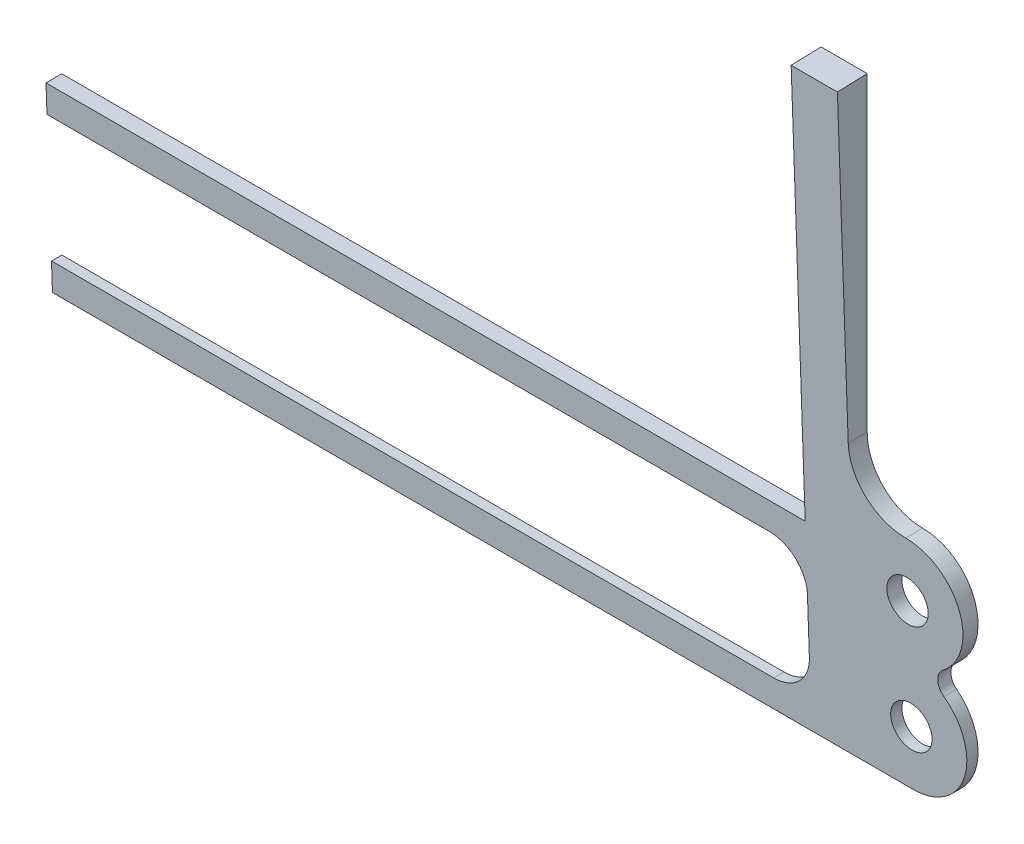
ISO-10303-21;
HEADER;
FILE_DESCRIPTION(('STEP AP214'),'2;1');
FILE_NAME('part.step','',(''),(''),'','','');
FILE_SCHEMA(('AUTOMOTIVE_DESIGN { 1 0 10303 214 1 1 1 1 }'));
ENDSEC;
DATA;
#1=APPLICATION_CONTEXT('core data for automotive mechanical design processes');
#2=APPLICATION_PROTOCOL_DEFINITION('international standard','automotive_design',2000,#1);
#3=PRODUCT_CONTEXT('',#1,'mechanical');
#4=PRODUCT('Part','Part','',(#3));
#5=PRODUCT_RELATED_PRODUCT_CATEGORY('part','',(#4));
#6=PRODUCT_DEFINITION_FORMATION('','',#4);
#7=PRODUCT_DEFINITION_CONTEXT('part definition',#1,'design');
#8=PRODUCT_DEFINITION('design','',#6,#7);
#9=PRODUCT_DEFINITION_SHAPE('','',#8);
#10=(LENGTH_UNIT() NAMED_UNIT(*) SI_UNIT(.MILLI.,.METRE.));
#11=(NAMED_UNIT(*) PLANE_ANGLE_UNIT() SI_UNIT($,.RADIAN.));
#12=(NAMED_UNIT(*) SI_UNIT($,.STERADIAN.) SOLID_ANGLE_UNIT());
#13=UNCERTAINTY_MEASURE_WITH_UNIT(LENGTH_MEASURE(1.E-05),#10,'distance_accuracy_value','');
#14=(GEOMETRIC_REPRESENTATION_CONTEXT(3) GLOBAL_UNCERTAINTY_ASSIGNED_CONTEXT((#13)) GLOBAL_UNIT_ASSIGNED_CONTEXT((#10,
#11,#12)) REPRESENTATION_CONTEXT('',''));
#15=CARTESIAN_POINT('',(0.,0.,0.));
#16=DIRECTION('',(0.,0.,1.));
#17=DIRECTION('',(1.,0.,0.));
#18=AXIS2_PLACEMENT_3D('',#15,#16,#17);
#19=CARTESIAN_POINT('',(-7.95019999999749,0.,76.2));
#20=DIRECTION('',(1.,0.,0.));
#21=DIRECTION('',(0.,0.,-1.));
#22=AXIS2_PLACEMENT_3D('',#19,#20,#21);
#23=PLANE('',#22);
#24=DIRECTION('',(0.,0.999390827019096,0.0348994967025044));
#25=VECTOR('',#24,1.);
#26=CARTESIAN_POINT('',(-7.95019999999749,2.57484000352105,2.46622949619527));
#27=LINE('',#26,#25);
#28=CARTESIAN_POINT('',(-7.95019999999749,9.52500000000004,2.70893443136311));
#29=VERTEX_POINT('',#28);
#30=CARTESIAN_POINT('',(-7.95019999999749,78.5876000000001,5.12065356646412));
#31=VERTEX_POINT('',#30);
#32=EDGE_CURVE('E283',#29,#31,#27,.T.);
#33=ORIENTED_EDGE('',*,*,#32,.T.);
#34=DIRECTION('',(0.,0.0348994967025044,-0.999390827019096));
#35=VECTOR('',#34,1.);
#36=CARTESIAN_POINT('',(-7.95019999999749,76.012759996479,78.8544240702688));
#37=LINE('',#36,#35);
#38=CARTESIAN_POINT('',(-7.95019999999749,78.7664171628417,0.));
#39=VERTEX_POINT('',#38);
#40=EDGE_CURVE('E50',#31,#39,#37,.T.);
#41=ORIENTED_EDGE('',*,*,#40,.T.);
#42=DIRECTION('',(0.,-1.,0.));
#43=VECTOR('',#42,1.);
#44=CARTESIAN_POINT('',(-7.95019999999749,0.,0.));
#45=LINE('',#44,#43);
#46=CARTESIAN_POINT('',(-7.95019999999749,9.52500000000006,0.));
#47=VERTEX_POINT('',#46);
#48=EDGE_CURVE('E192',#39,#47,#45,.T.);
#49=ORIENTED_EDGE('',*,*,#48,.T.);
#50=DIRECTION('',(0.,0.,-1.));
#51=VECTOR('',#50,1.);
#52=CARTESIAN_POINT('',(-7.95019999999749,9.52500000000006,76.2));
#53=LINE('',#52,#51);
#54=EDGE_CURVE('E204',#29,#47,#53,.T.);
#55=ORIENTED_EDGE('',*,*,#54,.F.);
#56=EDGE_LOOP('',(#33,#41,#49,#55));
#57=FACE_BOUND('',#56,.T.);
#58=ADVANCED_FACE('F35',(#57),#23,.F.);
#59=CARTESIAN_POINT('',(0.,9.52500000000004,76.2));
#60=DIRECTION('',(0.,-1.,0.));
#61=DIRECTION('',(1.,0.,0.));
#62=AXIS2_PLACEMENT_3D('',#59,#60,#61);
#63=PLANE('',#62);
#64=DIRECTION('',(-1.,0.,0.));
#65=VECTOR('',#64,1.);
#66=CARTESIAN_POINT('',(0.,9.52500000000004,0.));
#67=LINE('',#66,#65);
#68=CARTESIAN_POINT('',(-138.423649999999,9.52500000000005,0.));
#69=VERTEX_POINT('',#68);
#70=EDGE_CURVE('E194',#47,#69,#67,.T.);
#71=ORIENTED_EDGE('',*,*,#70,.T.);
#72=DIRECTION('',(0.,0.,1.));
#73=VECTOR('',#72,1.);
#74=CARTESIAN_POINT('',(-138.423649999999,9.52500000000004,76.2));
#75=LINE('',#74,#73);
#76=CARTESIAN_POINT('',(-138.423649999999,9.52500000000006,2.7089344313631));
#77=VERTEX_POINT('',#76);
#78=EDGE_CURVE('E358',#69,#77,#75,.T.);
#79=ORIENTED_EDGE('',*,*,#78,.T.);
#80=DIRECTION('',(1.,0.,0.));
#81=VECTOR('',#80,1.);
#82=CARTESIAN_POINT('',(0.,9.52500000000004,2.70893443136311));
#83=LINE('',#82,#81);
#84=EDGE_CURVE('E281',#77,#29,#83,.T.);
#85=ORIENTED_EDGE('',*,*,#84,.T.);
#86=ORIENTED_EDGE('',*,*,#54,.T.);
#87=EDGE_LOOP('',(#71,#79,#85,#86));
#88=FACE_BOUND('',#87,.T.);
#89=ADVANCED_FACE('F309',(#88),#63,.F.);
#90=CARTESIAN_POINT('',(0.,-22.225,76.2));
#91=DIRECTION('',(0.,1.,0.));
#92=DIRECTION('',(0.,0.,1.));
#93=AXIS2_PLACEMENT_3D('',#90,#91,#92);
#94=PLANE('',#93);
#95=DIRECTION('',(-1.,0.,0.));
#96=VECTOR('',#95,1.);
#97=CARTESIAN_POINT('',(19.0500000000025,-22.225,1.6002));
#98=LINE('',#97,#96);
#99=CARTESIAN_POINT('',(9.52500000000168,-22.2249999999999,1.6002));
#100=VERTEX_POINT('',#99);
#101=CARTESIAN_POINT('',(-138.423649999999,-22.225,1.6002));
#102=VERTEX_POINT('',#101);
#103=EDGE_CURVE('E273',#100,#102,#98,.T.);
#104=ORIENTED_EDGE('',*,*,#103,.T.);
#105=DIRECTION('',(0.,0.,-1.));
#106=VECTOR('',#105,1.);
#107=CARTESIAN_POINT('',(-138.423649999999,-22.225,76.2));
#108=LINE('',#107,#106);
#109=CARTESIAN_POINT('',(-138.423649999999,-22.225,0.));
#110=VERTEX_POINT('',#109);
#111=EDGE_CURVE('E275',#102,#110,#108,.T.);
#112=ORIENTED_EDGE('',*,*,#111,.T.);
#113=DIRECTION('',(1.,0.,0.));
#114=VECTOR('',#113,1.);
#115=CARTESIAN_POINT('',(0.,-22.225,0.));
#116=LINE('',#115,#114);
#117=CARTESIAN_POINT('',(9.52500000000168,-22.2249999999999,0.));
#118=VERTEX_POINT('',#117);
#119=EDGE_CURVE('E181',#110,#118,#116,.T.);
#120=ORIENTED_EDGE('',*,*,#119,.T.);
#121=DIRECTION('',(0.,0.,-1.));
#122=VECTOR('',#121,1.);
#123=CARTESIAN_POINT('',(9.52500000000168,-22.2249999999999,76.2));
#124=LINE('',#123,#122);
#125=EDGE_CURVE('E208',#100,#118,#124,.T.);
#126=ORIENTED_EDGE('',*,*,#125,.F.);
#127=EDGE_LOOP('',(#104,#112,#120,#126));
#128=FACE_BOUND('',#127,.T.);
#129=ADVANCED_FACE('F315',(#128),#94,.F.);
#130=CARTESIAN_POINT('',(9.52500000000168,-12.6999999999999,76.2));
#131=DIRECTION('',(0.,0.,-1.));
#132=DIRECTION('',(-1.,0.,0.));
#133=AXIS2_PLACEMENT_3D('',#130,#131,#132);
#134=CYLINDRICAL_SURFACE('',#133,9.525);
#135=CARTESIAN_POINT('',(9.52500000000168,-12.6999999999999,0.));
#136=DIRECTION('',(0.,0.,1.));
#137=DIRECTION('',(1.,0.,0.));
#138=AXIS2_PLACEMENT_3D('',#135,#136,#137);
#139=CIRCLE('',#138,9.525);
#140=CARTESIAN_POINT('',(15.3712965050969,-5.18026315789494,0.));
#141=VERTEX_POINT('',#140);
#142=EDGE_CURVE('E183',#118,#141,#139,.T.);
#143=ORIENTED_EDGE('',*,*,#142,.T.);
#144=DIRECTION('',(0.,0.,-1.));
#145=VECTOR('',#144,1.);
#146=CARTESIAN_POINT('',(15.3712965050969,-5.18026315789494,76.2));
#147=LINE('',#146,#145);
#148=CARTESIAN_POINT('',(15.3712965050969,-5.18026315789493,2.19541532631071));
#149=VERTEX_POINT('',#148);
#150=EDGE_CURVE('E217',#141,#149,#147,.F.);
#151=ORIENTED_EDGE('',*,*,#150,.T.);
#152=CARTESIAN_POINT('',(9.52500000000168,-12.6999999999999,1.93282032940893));
#153=DIRECTION('',(0.,0.0348994967025044,-0.999390827019096));
#154=DIRECTION('',(0.,-0.999390827019096,-0.0348994967025044));
#155=AXIS2_PLACEMENT_3D('',#152,#153,#154);
#156=ELLIPSE('',#155,9.53080590944628,9.525);
#157=EDGE_CURVE('E179',#149,#100,#156,.T.);
#158=ORIENTED_EDGE('',*,*,#157,.T.);
#159=ORIENTED_EDGE('',*,*,#125,.T.);
#160=EDGE_LOOP('',(#143,#151,#158,#159));
#161=FACE_BOUND('',#160,.T.);
#162=ADVANCED_FACE('F325',(#161),#134,.T.);
#163=CARTESIAN_POINT('',(9.52500000000251,6.35000000000005,76.2));
#164=DIRECTION('',(0.,0.,-1.));
#165=DIRECTION('',(-1.,0.,0.));
#166=AXIS2_PLACEMENT_3D('',#163,#164,#165);
#167=CYLINDRICAL_SURFACE('',#166,9.525);
#168=CARTESIAN_POINT('',(9.52500000000251,6.35000000000005,2.59806098822679));
#169=DIRECTION('',(0.,0.0348994967025044,-0.999390827019096));
#170=DIRECTION('',(0.,-0.999390827019096,-0.0348994967025044));
#171=AXIS2_PLACEMENT_3D('',#168,#169,#170);
#172=ELLIPSE('',#171,9.53080590944628,9.525);
#173=CARTESIAN_POINT('',(9.52500000000251,15.8750000000001,2.93068131763571));
#174=VERTEX_POINT('',#173);
#175=CARTESIAN_POINT('',(15.3712965050971,-1.16973684210546,2.335465991325));
#176=VERTEX_POINT('',#175);
#177=EDGE_CURVE('E170',#174,#176,#172,.T.);
#178=ORIENTED_EDGE('',*,*,#177,.T.);
#179=DIRECTION('',(0.,0.,-1.));
#180=VECTOR('',#179,1.);
#181=CARTESIAN_POINT('',(15.3712965050971,-1.16973684210546,76.2));
#182=LINE('',#181,#180);
#183=CARTESIAN_POINT('',(15.3712965050971,-1.16973684210546,0.));
#184=VERTEX_POINT('',#183);
#185=EDGE_CURVE('E207',#176,#184,#182,.T.);
#186=ORIENTED_EDGE('',*,*,#185,.T.);
#187=CARTESIAN_POINT('',(9.52500000000251,6.35000000000005,0.));
#188=DIRECTION('',(0.,0.,1.));
#189=DIRECTION('',(1.,0.,0.));
#190=AXIS2_PLACEMENT_3D('',#187,#188,#189);
#191=CIRCLE('',#190,9.525);
#192=CARTESIAN_POINT('',(9.52500000000251,15.8750000000001,0.));
#193=VERTEX_POINT('',#192);
#194=EDGE_CURVE('E186',#184,#193,#191,.T.);
#195=ORIENTED_EDGE('',*,*,#194,.T.);
#196=DIRECTION('',(0.,0.,-1.));
#197=VECTOR('',#196,1.);
#198=CARTESIAN_POINT('',(9.52500000000251,15.8750000000001,76.2));
#199=LINE('',#198,#197);
#200=EDGE_CURVE('E210',#174,#193,#199,.T.);
#201=ORIENTED_EDGE('',*,*,#200,.F.);
#202=EDGE_LOOP('',(#178,#186,#195,#201));
#203=FACE_BOUND('',#202,.T.);
#204=ADVANCED_FACE('F321',(#203),#167,.T.);
#205=CARTESIAN_POINT('',(9.52500000000251,25.4000000000001,76.2));
#206=DIRECTION('',(0.,0.,-1.));
#207=DIRECTION('',(-1.,0.,0.));
#208=AXIS2_PLACEMENT_3D('',#205,#206,#207);
#209=CYLINDRICAL_SURFACE('',#208,9.525);
#210=CARTESIAN_POINT('',(9.52500000000251,25.4000000000001,3.26330164704465));
#211=DIRECTION('',(0.,0.0348994967025044,-0.999390827019096));
#212=DIRECTION('',(0.,-0.999390827019096,-0.0348994967025044));
#213=AXIS2_PLACEMENT_3D('',#210,#211,#212);
#214=ELLIPSE('',#213,9.53080590944628,9.525);
#215=CARTESIAN_POINT('',(0.,25.4000000000001,3.26330164704465));
#216=VERTEX_POINT('',#215);
#217=EDGE_CURVE('E166',#174,#216,#214,.T.);
#218=ORIENTED_EDGE('',*,*,#217,.F.);
#219=ORIENTED_EDGE('',*,*,#200,.T.);
#220=CARTESIAN_POINT('',(9.52500000000251,25.4000000000001,0.));
#221=DIRECTION('',(0.,0.,1.));
#222=DIRECTION('',(1.,0.,0.));
#223=AXIS2_PLACEMENT_3D('',#220,#221,#222);
#224=CIRCLE('',#223,9.525);
#225=CARTESIAN_POINT('',(0.,25.4000000000001,0.));
#226=VERTEX_POINT('',#225);
#227=EDGE_CURVE('E188',#226,#193,#224,.T.);
#228=ORIENTED_EDGE('',*,*,#227,.F.);
#229=DIRECTION('',(0.,0.,-1.));
#230=VECTOR('',#229,1.);
#231=CARTESIAN_POINT('',(0.,25.4000000000001,76.2));
#232=LINE('',#231,#230);
#233=EDGE_CURVE('E203',#216,#226,#232,.T.);
#234=ORIENTED_EDGE('',*,*,#233,.F.);
#235=EDGE_LOOP('',(#218,#219,#228,#234));
#236=FACE_BOUND('',#235,.T.);
#237=ADVANCED_FACE('F305',(#236),#209,.F.);
#238=CARTESIAN_POINT('',(0.,0.,76.2));
#239=DIRECTION('',(-1.,0.,0.));
#240=DIRECTION('',(0.,0.,1.));
#241=AXIS2_PLACEMENT_3D('',#238,#239,#240);
#242=PLANE('',#241);
#243=DIRECTION('',(0.,1.,0.));
#244=VECTOR('',#243,1.);
#245=CARTESIAN_POINT('',(0.,0.,0.));
#246=LINE('',#245,#244);
#247=CARTESIAN_POINT('',(0.,78.7664171628417,0.));
#248=VERTEX_POINT('',#247);
#249=EDGE_CURVE('E162',#226,#248,#246,.T.);
#250=ORIENTED_EDGE('',*,*,#249,.T.);
#251=DIRECTION('',(0.,-0.0348994967025044,0.999390827019096));
#252=VECTOR('',#251,1.);
#253=CARTESIAN_POINT('',(0.,76.012759996479,78.8544240702688));
#254=LINE('',#253,#252);
#255=CARTESIAN_POINT('',(0.,78.5876000000001,5.12065356646412));
#256=VERTEX_POINT('',#255);
#257=EDGE_CURVE('E148',#248,#256,#254,.T.);
#258=ORIENTED_EDGE('',*,*,#257,.T.);
#259=DIRECTION('',(0.,-0.999390827019096,-0.0348994967025044));
#260=VECTOR('',#259,1.);
#261=CARTESIAN_POINT('',(0.,2.57484000352105,2.46622949619527));
#262=LINE('',#261,#260);
#263=EDGE_CURVE('E159',#256,#216,#262,.T.);
#264=ORIENTED_EDGE('',*,*,#263,.T.);
#265=ORIENTED_EDGE('',*,*,#233,.T.);
#266=EDGE_LOOP('',(#250,#258,#264,#265));
#267=FACE_BOUND('',#266,.T.);
#268=ADVANCED_FACE('F158',(#267),#242,.F.);
#269=CARTESIAN_POINT('',(9.52500000000168,-12.6999999999999,76.2));
#270=DIRECTION('',(0.,0.,-1.));
#271=DIRECTION('',(-1.,0.,0.));
#272=AXIS2_PLACEMENT_3D('',#269,#270,#271);
#273=CYLINDRICAL_SURFACE('',#272,3.556);
#274=CARTESIAN_POINT('',(9.52500000000168,-12.6999999999999,1.93282032940893));
#275=DIRECTION('',(0.,0.0348994967025044,-0.999390827019096));
#276=DIRECTION('',(0.,-0.999390827019096,-0.0348994967025044));
#277=AXIS2_PLACEMENT_3D('',#274,#275,#276);
#278=ELLIPSE('',#277,3.55816753952661,3.556);
#279=CARTESIAN_POINT('',(9.52500000000168,-16.2559999999999,1.80864207309627));
#280=VERTEX_POINT('',#279);
#281=EDGE_CURVE('E168',#280,#280,#278,.T.);
#282=ORIENTED_EDGE('',*,*,#281,.F.);
#283=EDGE_LOOP('',(#282));
#284=FACE_BOUND('',#283,.T.);
#285=CARTESIAN_POINT('',(9.52500000000168,-12.6999999999999,0.));
#286=DIRECTION('',(0.,0.,1.));
#287=DIRECTION('',(1.,0.,0.));
#288=AXIS2_PLACEMENT_3D('',#285,#286,#287);
#289=CIRCLE('',#288,3.556);
#290=CARTESIAN_POINT('',(13.0810000000017,-12.6999999999999,0.));
#291=VERTEX_POINT('',#290);
#292=EDGE_CURVE('E200',#291,#291,#289,.T.);
#293=ORIENTED_EDGE('',*,*,#292,.F.);
#294=EDGE_LOOP('',(#293));
#295=FACE_BOUND('',#294,.T.);
#296=ADVANCED_FACE('F291',(#284,#295),#273,.F.);
#297=CARTESIAN_POINT('',(9.52500000000251,6.35000000000005,76.2));
#298=DIRECTION('',(0.,0.,-1.));
#299=DIRECTION('',(-1.,0.,0.));
#300=AXIS2_PLACEMENT_3D('',#297,#298,#299);
#301=CYLINDRICAL_SURFACE('',#300,3.556);
#302=CARTESIAN_POINT('',(9.52500000000251,6.35000000000005,2.59806098822679));
#303=DIRECTION('',(0.,0.0348994967025044,-0.999390827019096));
#304=DIRECTION('',(0.,-0.999390827019096,-0.0348994967025044));
#305=AXIS2_PLACEMENT_3D('',#302,#303,#304);
#306=ELLIPSE('',#305,3.55816753952661,3.556);
#307=CARTESIAN_POINT('',(9.52500000000251,2.79400000000005,2.47388273191412));
#308=VERTEX_POINT('',#307);
#309=EDGE_CURVE('E173',#308,#308,#306,.T.);
#310=ORIENTED_EDGE('',*,*,#309,.F.);
#311=EDGE_LOOP('',(#310));
#312=FACE_BOUND('',#311,.T.);
#313=CARTESIAN_POINT('',(9.52500000000251,6.35000000000005,0.));
#314=DIRECTION('',(0.,0.,1.));
#315=DIRECTION('',(1.,0.,0.));
#316=AXIS2_PLACEMENT_3D('',#313,#314,#315);
#317=CIRCLE('',#316,3.556);
#318=CARTESIAN_POINT('',(13.0810000000025,6.35000000000005,0.));
#319=VERTEX_POINT('',#318);
#320=EDGE_CURVE('E197',#319,#319,#317,.T.);
#321=ORIENTED_EDGE('',*,*,#320,.F.);
#322=EDGE_LOOP('',(#321));
#323=FACE_BOUND('',#322,.T.);
#324=ADVANCED_FACE('F288',(#312,#323),#301,.F.);
#325=CARTESIAN_POINT('',(0.,0.,0.));
#326=DIRECTION('',(0.,0.,1.));
#327=DIRECTION('',(1.,0.,0.));
#328=AXIS2_PLACEMENT_3D('',#325,#326,#327);
#329=PLANE('',#328);
#330=ORIENTED_EDGE('',*,*,#48,.F.);
#331=DIRECTION('',(1.,0.,0.));
#332=VECTOR('',#331,1.);
#333=CARTESIAN_POINT('',(0.,78.7664171628417,0.));
#334=LINE('',#333,#332);
#335=EDGE_CURVE('E154',#39,#248,#334,.T.);
#336=ORIENTED_EDGE('',*,*,#335,.T.);
#337=ORIENTED_EDGE('',*,*,#249,.F.);
#338=ORIENTED_EDGE('',*,*,#227,.T.);
#339=ORIENTED_EDGE('',*,*,#194,.F.);
#340=CARTESIAN_POINT('',(16.9303089064556,-3.17500000000027,0.));
#341=DIRECTION('',(0.,0.,1.));
#342=DIRECTION('',(1.,0.,0.));
#343=AXIS2_PLACEMENT_3D('',#340,#341,#342);
#344=CIRCLE('',#343,2.54);
#345=EDGE_CURVE('E219',#184,#141,#344,.T.);
#346=ORIENTED_EDGE('',*,*,#345,.T.);
#347=ORIENTED_EDGE('',*,*,#142,.F.);
#348=ORIENTED_EDGE('',*,*,#119,.F.);
#349=DIRECTION('',(0.,1.,0.));
#350=VECTOR('',#349,1.);
#351=CARTESIAN_POINT('',(-138.423649999999,0.,0.));
#352=LINE('',#351,#350);
#353=CARTESIAN_POINT('',(-138.423649999999,-17.4498,0.));
#354=VERTEX_POINT('',#353);
#355=EDGE_CURVE('E360',#110,#354,#352,.T.);
#356=ORIENTED_EDGE('',*,*,#355,.T.);
#357=DIRECTION('',(-1.,0.,0.));
#358=VECTOR('',#357,1.);
#359=CARTESIAN_POINT('',(-268.897099999997,-17.4498,0.));
#360=LINE('',#359,#358);
#361=CARTESIAN_POINT('',(-14.3001999999975,-17.4497999999999,0.));
#362=VERTEX_POINT('',#361);
#363=EDGE_CURVE('E267',#362,#354,#360,.T.);
#364=ORIENTED_EDGE('',*,*,#363,.F.);
#365=CARTESIAN_POINT('',(-14.3001999999975,-11.0997999999999,0.));
#366=DIRECTION('',(0.,0.,1.));
#367=DIRECTION('',(1.,0.,0.));
#368=AXIS2_PLACEMENT_3D('',#365,#366,#367);
#369=CIRCLE('',#368,6.35);
#370=CARTESIAN_POINT('',(-7.9501999999975,-11.0998,0.));
#371=VERTEX_POINT('',#370);
#372=EDGE_CURVE('E247',#362,#371,#369,.T.);
#373=ORIENTED_EDGE('',*,*,#372,.T.);
#374=DIRECTION('',(0.,-1.,0.));
#375=VECTOR('',#374,1.);
#376=CARTESIAN_POINT('',(-7.95019999999749,4.74980000000006,0.));
#377=LINE('',#376,#375);
#378=CARTESIAN_POINT('',(-7.9501999999975,-1.60019999999994,0.));
#379=VERTEX_POINT('',#378);
#380=EDGE_CURVE('E265',#379,#371,#377,.T.);
#381=ORIENTED_EDGE('',*,*,#380,.F.);
#382=CARTESIAN_POINT('',(-14.3001999999975,-1.60019999999994,0.));
#383=DIRECTION('',(0.,0.,1.));
#384=DIRECTION('',(1.,0.,0.));
#385=AXIS2_PLACEMENT_3D('',#382,#383,#384);
#386=CIRCLE('',#385,6.35);
#387=CARTESIAN_POINT('',(-14.3001999999975,4.74980000000006,0.));
#388=VERTEX_POINT('',#387);
#389=EDGE_CURVE('E242',#379,#388,#386,.T.);
#390=ORIENTED_EDGE('',*,*,#389,.T.);
#391=DIRECTION('',(1.,0.,0.));
#392=VECTOR('',#391,1.);
#393=CARTESIAN_POINT('',(-7.95019999999749,4.74980000000006,0.));
#394=LINE('',#393,#392);
#395=CARTESIAN_POINT('',(-138.423649999999,4.74980000000005,0.));
#396=VERTEX_POINT('',#395);
#397=EDGE_CURVE('E271',#396,#388,#394,.T.);
#398=ORIENTED_EDGE('',*,*,#397,.F.);
#399=EDGE_CURVE('E356',#396,#69,#352,.T.);
#400=ORIENTED_EDGE('',*,*,#399,.T.);
#401=ORIENTED_EDGE('',*,*,#70,.F.);
#402=EDGE_LOOP('',(#330,#336,#337,#338,#339,#346,#347,#348,#356,#364,#373,#381,#390,#398,#400,#401));
#403=FACE_BOUND('',#402,.T.);
#404=ORIENTED_EDGE('',*,*,#320,.T.);
#405=EDGE_LOOP('',(#404));
#406=FACE_BOUND('',#405,.T.);
#407=ORIENTED_EDGE('',*,*,#292,.T.);
#408=EDGE_LOOP('',(#407));
#409=FACE_BOUND('',#408,.T.);
#410=ADVANCED_FACE('F263',(#403,#406,#409),#329,.F.);
#411=CARTESIAN_POINT('',(19.0500000000025,-22.225,1.6002));
#412=DIRECTION('',(0.,0.0348994967025044,-0.999390827019096));
#413=DIRECTION('',(0.,0.999390827019096,0.0348994967025044));
#414=AXIS2_PLACEMENT_3D('',#411,#412,#413);
#415=PLANE('',#414);
#416=ORIENTED_EDGE('',*,*,#281,.T.);
#417=EDGE_LOOP('',(#416));
#418=FACE_BOUND('',#417,.T.);
#419=ORIENTED_EDGE('',*,*,#309,.T.);
#420=EDGE_LOOP('',(#419));
#421=FACE_BOUND('',#420,.T.);
#422=ORIENTED_EDGE('',*,*,#263,.F.);
#423=DIRECTION('',(1.,0.,0.));
#424=VECTOR('',#423,1.);
#425=CARTESIAN_POINT('',(-138.423649999999,78.5876000000001,5.12065356646412));
#426=LINE('',#425,#424);
#427=EDGE_CURVE('E145',#31,#256,#426,.T.);
#428=ORIENTED_EDGE('',*,*,#427,.F.);
#429=ORIENTED_EDGE('',*,*,#32,.F.);
#430=ORIENTED_EDGE('',*,*,#84,.F.);
#431=DIRECTION('',(0.,0.999390827019096,0.0348994967025044));
#432=VECTOR('',#431,1.);
#433=CARTESIAN_POINT('',(-138.423649999999,-42.9005162307363,0.878195063583495));
#434=LINE('',#433,#432);
#435=CARTESIAN_POINT('',(-138.423649999999,4.74980000000006,2.54218077288609));
#436=VERTEX_POINT('',#435);
#437=EDGE_CURVE('E352',#436,#77,#434,.T.);
#438=ORIENTED_EDGE('',*,*,#437,.F.);
#439=DIRECTION('',(1.,0.,0.));
#440=VECTOR('',#439,1.);
#441=CARTESIAN_POINT('',(19.0500000000025,4.74980000000006,2.54218077288609));
#442=LINE('',#441,#440);
#443=CARTESIAN_POINT('',(-14.3001999999975,4.74980000000006,2.54218077288609));
#444=VERTEX_POINT('',#443);
#445=EDGE_CURVE('E223',#436,#444,#442,.T.);
#446=ORIENTED_EDGE('',*,*,#445,.T.);
#447=CARTESIAN_POINT('',(-14.3001999999975,-1.60019999999994,2.32043388661347));
#448=DIRECTION('',(0.,0.0348994967025044,-0.999390827019096));
#449=DIRECTION('',(0.,0.999390827019096,0.0348994967025044));
#450=AXIS2_PLACEMENT_3D('',#447,#448,#449);
#451=ELLIPSE('',#450,6.35387060629752,6.35);
#452=CARTESIAN_POINT('',(-7.9501999999975,-1.60019999999994,2.32043388661347));
#453=VERTEX_POINT('',#452);
#454=EDGE_CURVE('E245',#444,#453,#451,.T.);
#455=ORIENTED_EDGE('',*,*,#454,.T.);
#456=DIRECTION('',(0.,-0.999390827019096,-0.0348994967025044));
#457=VECTOR('',#456,1.);
#458=CARTESIAN_POINT('',(-7.95019999999751,-22.2249999999999,1.6002));
#459=LINE('',#458,#457);
#460=CARTESIAN_POINT('',(-7.9501999999975,-11.0998,1.98870054474963));
#461=VERTEX_POINT('',#460);
#462=EDGE_CURVE('E225',#453,#461,#459,.T.);
#463=ORIENTED_EDGE('',*,*,#462,.T.);
#464=CARTESIAN_POINT('',(-14.3001999999975,-11.0997999999999,1.98870054474963));
#465=DIRECTION('',(0.,0.0348994967025044,-0.999390827019096));
#466=DIRECTION('',(0.,0.999390827019096,0.0348994967025044));
#467=AXIS2_PLACEMENT_3D('',#464,#465,#466);
#468=ELLIPSE('',#467,6.35387060629752,6.35);
#469=CARTESIAN_POINT('',(-14.3001999999975,-17.4498,1.76695365847701));
#470=VERTEX_POINT('',#469);
#471=EDGE_CURVE('E43',#461,#470,#468,.T.);
#472=ORIENTED_EDGE('',*,*,#471,.T.);
#473=DIRECTION('',(-1.,0.,0.));
#474=VECTOR('',#473,1.);
#475=CARTESIAN_POINT('',(19.0500000000025,-17.4497999999999,1.76695365847701));
#476=LINE('',#475,#474);
#477=CARTESIAN_POINT('',(-138.423649999999,-17.4498,1.76695365847701));
#478=VERTEX_POINT('',#477);
#479=EDGE_CURVE('E228',#470,#478,#476,.T.);
#480=ORIENTED_EDGE('',*,*,#479,.T.);
#481=EDGE_CURVE('E58',#102,#478,#434,.T.);
#482=ORIENTED_EDGE('',*,*,#481,.F.);
#483=ORIENTED_EDGE('',*,*,#103,.F.);
#484=ORIENTED_EDGE('',*,*,#157,.F.);
#485=CARTESIAN_POINT('',(16.9303089064556,-3.17500000000027,2.26544065881785));
#486=DIRECTION('',(0.,0.0348994967025044,-0.999390827019096));
#487=DIRECTION('',(0.,0.999390827019096,0.0348994967025044));
#488=AXIS2_PLACEMENT_3D('',#485,#486,#487);
#489=ELLIPSE('',#488,2.54154824251901,2.54);
#490=EDGE_CURVE('E221',#149,#176,#489,.T.);
#491=ORIENTED_EDGE('',*,*,#490,.T.);
#492=ORIENTED_EDGE('',*,*,#177,.F.);
#493=ORIENTED_EDGE('',*,*,#217,.T.);
#494=EDGE_LOOP('',(#422,#428,#429,#430,#438,#446,#455,#463,#472,#480,#482,#483,#484,#491,#492,#493));
#495=FACE_BOUND('',#494,.T.);
#496=ADVANCED_FACE('F164',(#418,#421,#495),#415,.F.);
#497=CARTESIAN_POINT('',(16.9303089064556,-3.17500000000027,76.2));
#498=DIRECTION('',(0.,0.,1.));
#499=DIRECTION('',(1.,0.,0.));
#500=AXIS2_PLACEMENT_3D('',#497,#498,#499);
#501=CYLINDRICAL_SURFACE('',#500,2.54);
#502=ORIENTED_EDGE('',*,*,#490,.F.);
#503=ORIENTED_EDGE('',*,*,#150,.F.);
#504=ORIENTED_EDGE('',*,*,#345,.F.);
#505=ORIENTED_EDGE('',*,*,#185,.F.);
#506=EDGE_LOOP('',(#502,#503,#504,#505));
#507=FACE_BOUND('',#506,.T.);
#508=ADVANCED_FACE('F333',(#507),#501,.F.);
#509=CARTESIAN_POINT('',(-268.897099999997,-17.4498,8.64110713292829));
#510=DIRECTION('',(0.,-1.,0.));
#511=DIRECTION('',(1.,0.,0.));
#512=AXIS2_PLACEMENT_3D('',#509,#510,#511);
#513=PLANE('',#512);
#514=ORIENTED_EDGE('',*,*,#363,.T.);
#515=DIRECTION('',(0.,0.,1.));
#516=VECTOR('',#515,1.);
#517=CARTESIAN_POINT('',(-138.423649999999,-17.4498,8.64110713292829));
#518=LINE('',#517,#516);
#519=EDGE_CURVE('E258',#354,#478,#518,.T.);
#520=ORIENTED_EDGE('',*,*,#519,.T.);
#521=ORIENTED_EDGE('',*,*,#479,.F.);
#522=DIRECTION('',(0.,0.,-1.));
#523=VECTOR('',#522,1.);
#524=CARTESIAN_POINT('',(-14.3001999999975,-17.4497999999999,0.));
#525=LINE('',#524,#523);
#526=EDGE_CURVE('E234',#470,#362,#525,.T.);
#527=ORIENTED_EDGE('',*,*,#526,.T.);
#528=EDGE_LOOP('',(#514,#520,#521,#527));
#529=FACE_BOUND('',#528,.T.);
#530=ADVANCED_FACE('F256',(#529),#513,.F.);
#531=CARTESIAN_POINT('',(-7.95019999999749,4.74980000000006,8.64110713292829));
#532=DIRECTION('',(1.,0.,0.));
#533=DIRECTION('',(0.,1.,0.));
#534=AXIS2_PLACEMENT_3D('',#531,#532,#533);
#535=PLANE('',#534);
#536=ORIENTED_EDGE('',*,*,#462,.F.);
#537=DIRECTION('',(0.,0.,-1.));
#538=VECTOR('',#537,1.);
#539=CARTESIAN_POINT('',(-7.9501999999975,-1.60019999999994,0.));
#540=LINE('',#539,#538);
#541=EDGE_CURVE('E239',#453,#379,#540,.T.);
#542=ORIENTED_EDGE('',*,*,#541,.T.);
#543=ORIENTED_EDGE('',*,*,#380,.T.);
#544=DIRECTION('',(0.,0.,-1.));
#545=VECTOR('',#544,1.);
#546=CARTESIAN_POINT('',(-7.9501999999975,-11.0998,1.76695365847701));
#547=LINE('',#546,#545);
#548=EDGE_CURVE('E237',#371,#461,#547,.F.);
#549=ORIENTED_EDGE('',*,*,#548,.T.);
#550=EDGE_LOOP('',(#536,#542,#543,#549));
#551=FACE_BOUND('',#550,.T.);
#552=ADVANCED_FACE('F269',(#551),#535,.F.);
#553=CARTESIAN_POINT('',(-7.95019999999749,4.74980000000006,8.64110713292829));
#554=DIRECTION('',(0.,1.,0.));
#555=DIRECTION('',(-1.,0.,0.));
#556=AXIS2_PLACEMENT_3D('',#553,#554,#555);
#557=PLANE('',#556);
#558=ORIENTED_EDGE('',*,*,#445,.F.);
#559=DIRECTION('',(0.,0.,-1.));
#560=VECTOR('',#559,1.);
#561=CARTESIAN_POINT('',(-138.423649999999,4.74980000000005,8.64110713292829));
#562=LINE('',#561,#560);
#563=EDGE_CURVE('E11',#436,#396,#562,.T.);
#564=ORIENTED_EDGE('',*,*,#563,.T.);
#565=ORIENTED_EDGE('',*,*,#397,.T.);
#566=DIRECTION('',(0.,0.,-1.));
#567=VECTOR('',#566,1.);
#568=CARTESIAN_POINT('',(-14.3001999999975,4.74980000000006,2.54218077288609));
#569=LINE('',#568,#567);
#570=EDGE_CURVE('E231',#388,#444,#569,.F.);
#571=ORIENTED_EDGE('',*,*,#570,.T.);
#572=EDGE_LOOP('',(#558,#564,#565,#571));
#573=FACE_BOUND('',#572,.T.);
#574=ADVANCED_FACE('F338',(#573),#557,.F.);
#575=CARTESIAN_POINT('',(-14.3001999999975,-1.60019999999994,8.64110713292829));
#576=DIRECTION('',(0.,0.,1.));
#577=DIRECTION('',(1.,0.,0.));
#578=AXIS2_PLACEMENT_3D('',#575,#576,#577);
#579=CYLINDRICAL_SURFACE('',#578,6.35);
#580=ORIENTED_EDGE('',*,*,#454,.F.);
#581=ORIENTED_EDGE('',*,*,#570,.F.);
#582=ORIENTED_EDGE('',*,*,#389,.F.);
#583=ORIENTED_EDGE('',*,*,#541,.F.);
#584=EDGE_LOOP('',(#580,#581,#582,#583));
#585=FACE_BOUND('',#584,.T.);
#586=ADVANCED_FACE('F336',(#585),#579,.F.);
#587=CARTESIAN_POINT('',(-14.3001999999975,-11.0997999999999,8.64110713292829));
#588=DIRECTION('',(0.,0.,1.));
#589=DIRECTION('',(1.,0.,0.));
#590=AXIS2_PLACEMENT_3D('',#587,#588,#589);
#591=CYLINDRICAL_SURFACE('',#590,6.35);
#592=ORIENTED_EDGE('',*,*,#471,.F.);
#593=ORIENTED_EDGE('',*,*,#548,.F.);
#594=ORIENTED_EDGE('',*,*,#372,.F.);
#595=ORIENTED_EDGE('',*,*,#526,.F.);
#596=EDGE_LOOP('',(#592,#593,#594,#595));
#597=FACE_BOUND('',#596,.T.);
#598=ADVANCED_FACE('F37',(#597),#591,.F.);
#599=CARTESIAN_POINT('',(-138.423649999999,-42.5991296493172,-7.7523874180071));
#600=DIRECTION('',(1.,0.,0.));
#601=DIRECTION('',(0.,0.,-1.));
#602=AXIS2_PLACEMENT_3D('',#599,#600,#601);
#603=PLANE('',#602);
#604=ORIENTED_EDGE('',*,*,#399,.F.);
#605=ORIENTED_EDGE('',*,*,#563,.F.);
#606=ORIENTED_EDGE('',*,*,#437,.T.);
#607=ORIENTED_EDGE('',*,*,#78,.F.);
#608=EDGE_LOOP('',(#604,#605,#606,#607));
#609=FACE_BOUND('',#608,.T.);
#610=ADVANCED_FACE('F344',(#609),#603,.F.);
#611=ORIENTED_EDGE('',*,*,#481,.T.);
#612=ORIENTED_EDGE('',*,*,#519,.F.);
#613=ORIENTED_EDGE('',*,*,#355,.F.);
#614=ORIENTED_EDGE('',*,*,#111,.F.);
#615=EDGE_LOOP('',(#611,#612,#613,#614));
#616=FACE_BOUND('',#615,.T.);
#617=ADVANCED_FACE('F372',(#616),#603,.F.);
#618=CARTESIAN_POINT('',(-138.423649999999,78.8889865814193,-3.50992891512647));
#619=DIRECTION('',(0.,-0.999390827019096,-0.0348994967025044));
#620=DIRECTION('',(0.,0.0348994967025044,-0.999390827019096));
#621=AXIS2_PLACEMENT_3D('',#618,#619,#620);
#622=PLANE('',#621);
#623=ORIENTED_EDGE('',*,*,#427,.T.);
#624=ORIENTED_EDGE('',*,*,#257,.F.);
#625=ORIENTED_EDGE('',*,*,#335,.F.);
#626=ORIENTED_EDGE('',*,*,#40,.F.);
#627=EDGE_LOOP('',(#623,#624,#625,#626));
#628=FACE_BOUND('',#627,.T.);
#629=ADVANCED_FACE('F147',(#628),#622,.F.);
#630=CLOSED_SHELL('',(#58,#89,#129,#162,#204,#237,#268,#296,#324,#410,#496,#508,#530,#552,#574,
#586,#598,#610,#617,#629));
#631=MANIFOLD_SOLID_BREP('B2',#630);
#632=ADVANCED_BREP_SHAPE_REPRESENTATION('',(#18,#631),#14);
#633=SHAPE_DEFINITION_REPRESENTATION(#9,#632);
ENDSEC;
END-ISO-10303-21;
